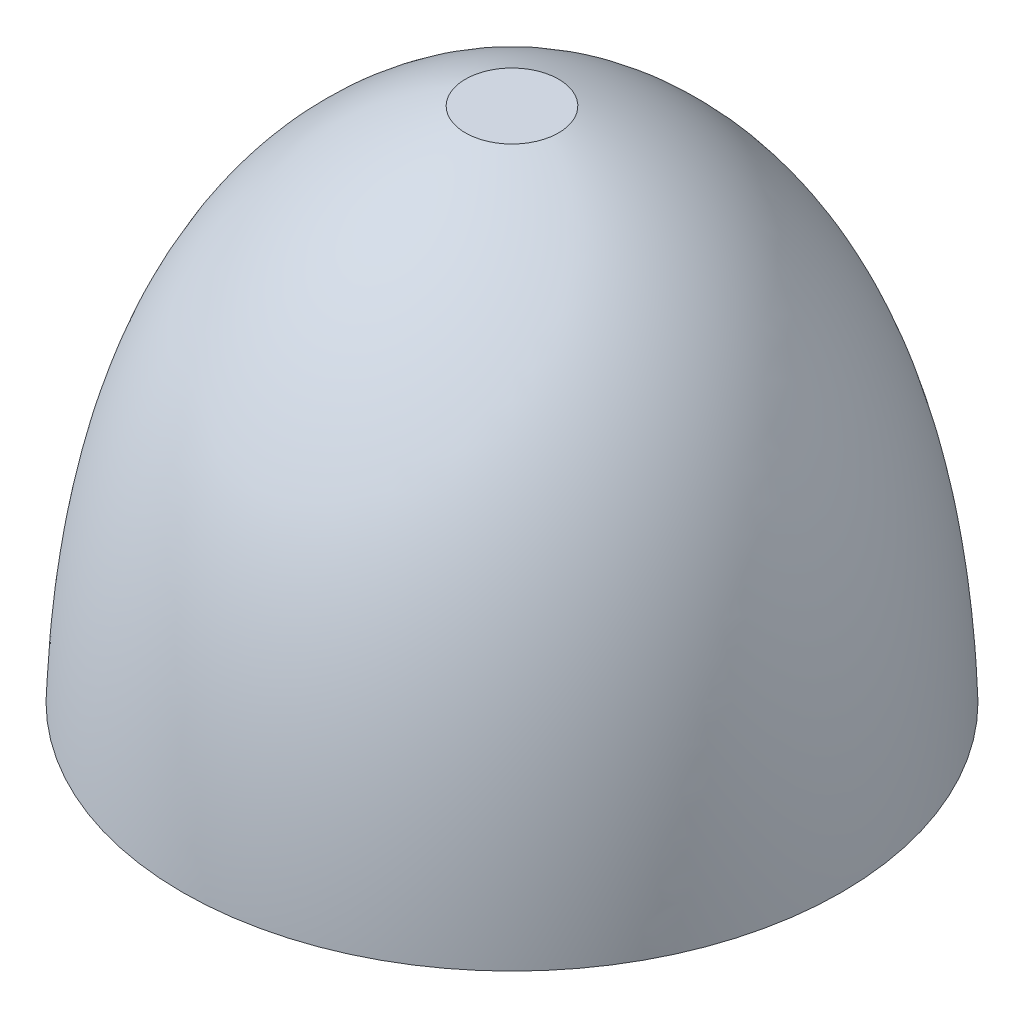
ISO-10303-21;
HEADER;
FILE_DESCRIPTION(('STEP AP214'),'2;1');
FILE_NAME('part.step','',(''),(''),'','','');
FILE_SCHEMA(('AUTOMOTIVE_DESIGN { 1 0 10303 214 1 1 1 1 }'));
ENDSEC;
DATA;
#1=APPLICATION_CONTEXT('core data for automotive mechanical design processes');
#2=APPLICATION_PROTOCOL_DEFINITION('international standard','automotive_design',2000,#1);
#3=PRODUCT_CONTEXT('',#1,'mechanical');
#4=PRODUCT('Part','Part','',(#3));
#5=PRODUCT_RELATED_PRODUCT_CATEGORY('part','',(#4));
#6=PRODUCT_DEFINITION_FORMATION('','',#4);
#7=PRODUCT_DEFINITION_CONTEXT('part definition',#1,'design');
#8=PRODUCT_DEFINITION('design','',#6,#7);
#9=PRODUCT_DEFINITION_SHAPE('','',#8);
#10=(LENGTH_UNIT() NAMED_UNIT(*) SI_UNIT(.MILLI.,.METRE.));
#11=(NAMED_UNIT(*) PLANE_ANGLE_UNIT() SI_UNIT($,.RADIAN.));
#12=(NAMED_UNIT(*) SI_UNIT($,.STERADIAN.) SOLID_ANGLE_UNIT());
#13=UNCERTAINTY_MEASURE_WITH_UNIT(LENGTH_MEASURE(1.E-05),#10,'distance_accuracy_value','');
#14=(GEOMETRIC_REPRESENTATION_CONTEXT(3) GLOBAL_UNCERTAINTY_ASSIGNED_CONTEXT((#13)) GLOBAL_UNIT_ASSIGNED_CONTEXT((#10,
#11,#12)) REPRESENTATION_CONTEXT('',''));
#15=CARTESIAN_POINT('',(0.,0.,0.));
#16=DIRECTION('',(0.,0.,1.));
#17=DIRECTION('',(1.,0.,0.));
#18=AXIS2_PLACEMENT_3D('',#15,#16,#17);
#19=CARTESIAN_POINT('',(0.,0.,0.));
#20=DIRECTION('',(0.,-1.,0.));
#21=DIRECTION('',(0.,0.,-1.));
#22=AXIS2_PLACEMENT_3D('',#19,#20,#21);
#23=PLANE('',#22);
#24=CARTESIAN_POINT('',(0.,0.,0.));
#25=DIRECTION('',(0.,-1.,0.));
#26=DIRECTION('',(0.,0.,-1.));
#27=AXIS2_PLACEMENT_3D('',#24,#25,#26);
#28=CIRCLE('',#27,150.);
#29=CARTESIAN_POINT('',(0.,0.,-150.));
#30=VERTEX_POINT('',#29);
#31=EDGE_CURVE('E44',#30,#30,#28,.T.);
#32=ORIENTED_EDGE('',*,*,#31,.T.);
#33=EDGE_LOOP('',(#32));
#34=FACE_BOUND('',#33,.T.);
#35=ADVANCED_FACE('F37',(#34),#23,.T.);
#36=CARTESIAN_POINT('',(0.,235.,0.));
#37=DIRECTION('',(0.,1.,0.));
#38=DIRECTION('',(0.,0.,1.));
#39=AXIS2_PLACEMENT_3D('',#36,#37,#38);
#40=PLANE('',#39);
#41=CARTESIAN_POINT('',(0.,235.,0.));
#42=DIRECTION('',(0.,-1.,0.));
#43=DIRECTION('',(0.,0.,-1.));
#44=AXIS2_PLACEMENT_3D('',#41,#42,#43);
#45=CIRCLE('',#44,21.2008579632936);
#46=CARTESIAN_POINT('',(0.,235.,-21.2008579632936));
#47=VERTEX_POINT('',#46);
#48=EDGE_CURVE('E10',#47,#47,#45,.T.);
#49=ORIENTED_EDGE('',*,*,#48,.F.);
#50=EDGE_LOOP('',(#49));
#51=FACE_BOUND('',#50,.T.);
#52=ADVANCED_FACE('F61',(#51),#40,.T.);
#53=CARTESIAN_POINT('',(150.,0.,0.));
#54=CARTESIAN_POINT('',(143.307610185633,192.957297178347,0.));
#55=CARTESIAN_POINT('',(21.2008579632936,235.,0.));
#56=B_SPLINE_CURVE_WITH_KNOTS('',2,(#53,#54,#55),.UNSPECIFIED.,.F.,.F.,(3,3),(0.,
0.876123487323936),.UNSPECIFIED.);
#57=CARTESIAN_POINT('',(0.,0.,0.));
#58=DIRECTION('',(0.,-1.,0.));
#59=AXIS1_PLACEMENT('',#57,#58);
#60=SURFACE_OF_REVOLUTION('',#56,#59);
#61=ORIENTED_EDGE('',*,*,#48,.T.);
#62=EDGE_LOOP('',(#61));
#63=FACE_BOUND('',#62,.T.);
#64=ORIENTED_EDGE('',*,*,#31,.F.);
#65=EDGE_LOOP('',(#64));
#66=FACE_BOUND('',#65,.T.);
#67=ADVANCED_FACE('F59',(#63,#66),#60,.F.);
#68=CLOSED_SHELL('',(#35,#52,#67));
#69=MANIFOLD_SOLID_BREP('B2',#68);
#70=ADVANCED_BREP_SHAPE_REPRESENTATION('',(#18,#69),#14);
#71=SHAPE_DEFINITION_REPRESENTATION(#9,#70);
ENDSEC;
END-ISO-10303-21;
